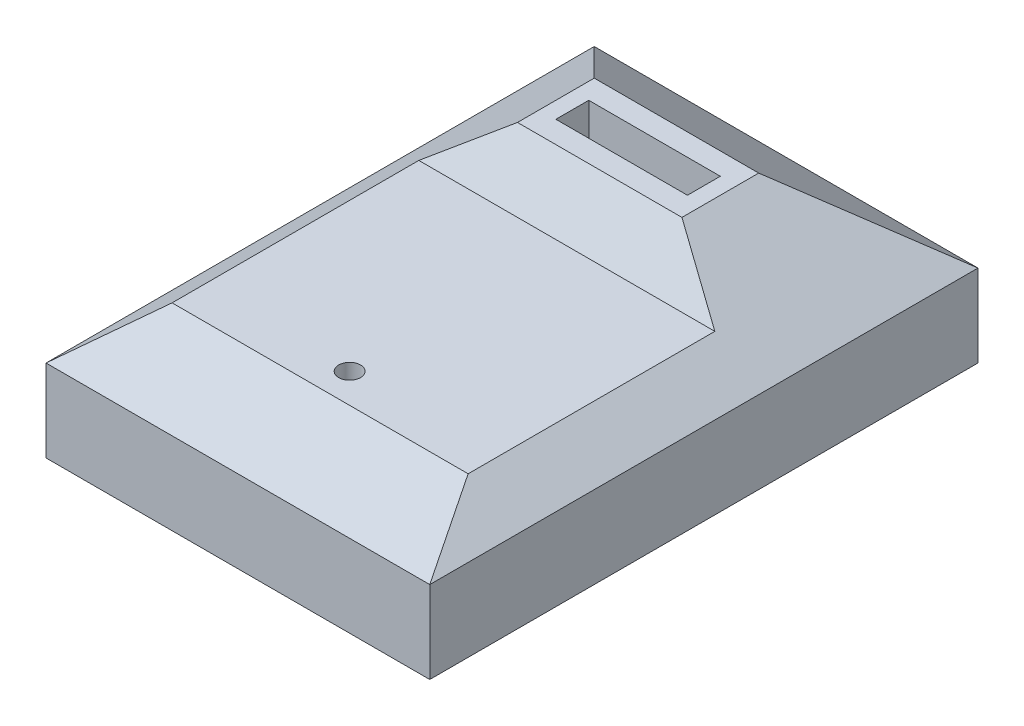
ISO-10303-21;
HEADER;
FILE_DESCRIPTION(('STEP AP214'),'2;1');
FILE_NAME('part.step','',(''),(''),'','','');
FILE_SCHEMA(('AUTOMOTIVE_DESIGN { 1 0 10303 214 1 1 1 1 }'));
ENDSEC;
DATA;
#1=APPLICATION_CONTEXT('core data for automotive mechanical design processes');
#2=APPLICATION_PROTOCOL_DEFINITION('international standard','automotive_design',2000,#1);
#3=PRODUCT_CONTEXT('',#1,'mechanical');
#4=PRODUCT('Part','Part','',(#3));
#5=PRODUCT_RELATED_PRODUCT_CATEGORY('part','',(#4));
#6=PRODUCT_DEFINITION_FORMATION('','',#4);
#7=PRODUCT_DEFINITION_CONTEXT('part definition',#1,'design');
#8=PRODUCT_DEFINITION('design','',#6,#7);
#9=PRODUCT_DEFINITION_SHAPE('','',#8);
#10=(LENGTH_UNIT() NAMED_UNIT(*) SI_UNIT(.MILLI.,.METRE.));
#11=(NAMED_UNIT(*) PLANE_ANGLE_UNIT() SI_UNIT($,.RADIAN.));
#12=(NAMED_UNIT(*) SI_UNIT($,.STERADIAN.) SOLID_ANGLE_UNIT());
#13=UNCERTAINTY_MEASURE_WITH_UNIT(LENGTH_MEASURE(1.E-05),#10,'distance_accuracy_value','');
#14=(GEOMETRIC_REPRESENTATION_CONTEXT(3) GLOBAL_UNCERTAINTY_ASSIGNED_CONTEXT((#13)) GLOBAL_UNIT_ASSIGNED_CONTEXT((#10,
#11,#12)) REPRESENTATION_CONTEXT('',''));
#15=CARTESIAN_POINT('',(0.,0.,0.));
#16=DIRECTION('',(0.,0.,1.));
#17=DIRECTION('',(1.,0.,0.));
#18=AXIS2_PLACEMENT_3D('',#15,#16,#17);
#19=CARTESIAN_POINT('',(35.,30.,79.6148351928655));
#20=DIRECTION('',(0.,-1.,0.));
#21=DIRECTION('',(0.,0.,-1.));
#22=AXIS2_PLACEMENT_3D('',#19,#20,#21);
#23=CYLINDRICAL_SURFACE('',#22,1.5);
#24=CARTESIAN_POINT('',(35.,12.,79.6148351928655));
#25=DIRECTION('',(0.,-1.,0.));
#26=DIRECTION('',(0.,0.,-1.));
#27=AXIS2_PLACEMENT_3D('',#24,#25,#26);
#28=CIRCLE('',#27,1.5);
#29=CARTESIAN_POINT('',(35.,12.,78.1148351928655));
#30=VERTEX_POINT('',#29);
#31=EDGE_CURVE('E363',#30,#30,#28,.T.);
#32=ORIENTED_EDGE('',*,*,#31,.T.);
#33=EDGE_LOOP('',(#32));
#34=FACE_BOUND('',#33,.T.);
#35=CARTESIAN_POINT('',(35.,18.,79.6148351928655));
#36=DIRECTION('',(0.,1.,0.));
#37=DIRECTION('',(0.,0.,1.));
#38=AXIS2_PLACEMENT_3D('',#35,#36,#37);
#39=CIRCLE('',#38,1.5);
#40=CARTESIAN_POINT('',(35.,18.,81.1148351928655));
#41=VERTEX_POINT('',#40);
#42=EDGE_CURVE('E359',#41,#41,#39,.F.);
#43=ORIENTED_EDGE('',*,*,#42,.F.);
#44=EDGE_LOOP('',(#43));
#45=FACE_BOUND('',#44,.T.);
#46=ADVANCED_FACE('F39',(#34,#45),#23,.F.);
#47=CARTESIAN_POINT('',(0.,0.,100.));
#48=DIRECTION('',(0.,1.,0.));
#49=DIRECTION('',(0.,0.,1.));
#50=AXIS2_PLACEMENT_3D('',#47,#48,#49);
#51=PLANE('',#50);
#52=DIRECTION('',(1.,0.,0.));
#53=VECTOR('',#52,1.);
#54=CARTESIAN_POINT('',(0.,0.,0.));
#55=LINE('',#54,#53);
#56=CARTESIAN_POINT('',(0.,0.,0.));
#57=VERTEX_POINT('',#56);
#58=CARTESIAN_POINT('',(70.,0.,0.));
#59=VERTEX_POINT('',#58);
#60=EDGE_CURVE('E560',#57,#59,#55,.T.);
#61=ORIENTED_EDGE('',*,*,#60,.T.);
#62=DIRECTION('',(0.,0.,-1.));
#63=VECTOR('',#62,1.);
#64=CARTESIAN_POINT('',(70.,0.,100.));
#65=LINE('',#64,#63);
#66=CARTESIAN_POINT('',(70.,0.,100.));
#67=VERTEX_POINT('',#66);
#68=EDGE_CURVE('E557',#67,#59,#65,.T.);
#69=ORIENTED_EDGE('',*,*,#68,.F.);
#70=DIRECTION('',(1.,0.,0.));
#71=VECTOR('',#70,1.);
#72=CARTESIAN_POINT('',(0.,0.,100.));
#73=LINE('',#72,#71);
#74=CARTESIAN_POINT('',(0.,0.,100.));
#75=VERTEX_POINT('',#74);
#76=EDGE_CURVE('E549',#75,#67,#73,.T.);
#77=ORIENTED_EDGE('',*,*,#76,.F.);
#78=DIRECTION('',(0.,0.,-1.));
#79=VECTOR('',#78,1.);
#80=CARTESIAN_POINT('',(0.,0.,100.));
#81=LINE('',#80,#79);
#82=EDGE_CURVE('E569',#75,#57,#81,.T.);
#83=ORIENTED_EDGE('',*,*,#82,.T.);
#84=EDGE_LOOP('',(#61,#69,#77,#83));
#85=FACE_BOUND('',#84,.T.);
#86=DIRECTION('',(1.,0.,0.));
#87=VECTOR('',#86,1.);
#88=CARTESIAN_POINT('',(0.,0.,2.));
#89=LINE('',#88,#87);
#90=CARTESIAN_POINT('',(2.,0.,2.));
#91=VERTEX_POINT('',#90);
#92=CARTESIAN_POINT('',(68.,0.,2.));
#93=VERTEX_POINT('',#92);
#94=EDGE_CURVE('E401',#91,#93,#89,.T.);
#95=ORIENTED_EDGE('',*,*,#94,.F.);
#96=DIRECTION('',(0.,0.,-1.));
#97=VECTOR('',#96,1.);
#98=CARTESIAN_POINT('',(2.,0.,100.));
#99=LINE('',#98,#97);
#100=CARTESIAN_POINT('',(2.,0.,98.));
#101=VERTEX_POINT('',#100);
#102=EDGE_CURVE('E434',#101,#91,#99,.T.);
#103=ORIENTED_EDGE('',*,*,#102,.F.);
#104=DIRECTION('',(1.,0.,0.));
#105=VECTOR('',#104,1.);
#106=CARTESIAN_POINT('',(0.,0.,98.));
#107=LINE('',#106,#105);
#108=CARTESIAN_POINT('',(68.,0.,98.));
#109=VERTEX_POINT('',#108);
#110=EDGE_CURVE('E390',#101,#109,#107,.T.);
#111=ORIENTED_EDGE('',*,*,#110,.T.);
#112=DIRECTION('',(0.,0.,-1.));
#113=VECTOR('',#112,1.);
#114=CARTESIAN_POINT('',(68.,0.,100.));
#115=LINE('',#114,#113);
#116=EDGE_CURVE('E407',#109,#93,#115,.T.);
#117=ORIENTED_EDGE('',*,*,#116,.T.);
#118=EDGE_LOOP('',(#95,#103,#111,#117));
#119=FACE_BOUND('',#118,.T.);
#120=ADVANCED_FACE('F632',(#85,#119),#51,.F.);
#121=CARTESIAN_POINT('',(0.,0.,100.));
#122=DIRECTION('',(1.,0.,0.));
#123=DIRECTION('',(0.,0.,-1.));
#124=AXIS2_PLACEMENT_3D('',#121,#122,#123);
#125=PLANE('',#124);
#126=DIRECTION('',(0.,-1.,0.));
#127=VECTOR('',#126,1.);
#128=CARTESIAN_POINT('',(0.,0.,100.));
#129=LINE('',#128,#127);
#130=CARTESIAN_POINT('',(0.,15.,100.));
#131=VERTEX_POINT('',#130);
#132=EDGE_CURVE('E546',#131,#75,#129,.T.);
#133=ORIENTED_EDGE('',*,*,#132,.F.);
#134=DIRECTION('',(0.,0.,1.));
#135=VECTOR('',#134,1.);
#136=CARTESIAN_POINT('',(0.,15.,0.));
#137=LINE('',#136,#135);
#138=CARTESIAN_POINT('',(0.,15.,0.));
#139=VERTEX_POINT('',#138);
#140=EDGE_CURVE('E527',#139,#131,#137,.T.);
#141=ORIENTED_EDGE('',*,*,#140,.F.);
#142=DIRECTION('',(0.,-1.,0.));
#143=VECTOR('',#142,1.);
#144=CARTESIAN_POINT('',(0.,0.,0.));
#145=LINE('',#144,#143);
#146=EDGE_CURVE('E542',#139,#57,#145,.T.);
#147=ORIENTED_EDGE('',*,*,#146,.T.);
#148=ORIENTED_EDGE('',*,*,#82,.F.);
#149=EDGE_LOOP('',(#133,#141,#147,#148));
#150=FACE_BOUND('',#149,.T.);
#151=ADVANCED_FACE('F41',(#150),#125,.F.);
#152=CARTESIAN_POINT('',(70.,0.,100.));
#153=DIRECTION('',(-1.,0.,0.));
#154=DIRECTION('',(0.,0.,1.));
#155=AXIS2_PLACEMENT_3D('',#152,#153,#154);
#156=PLANE('',#155);
#157=DIRECTION('',(0.,1.,0.));
#158=VECTOR('',#157,1.);
#159=CARTESIAN_POINT('',(70.,0.,0.));
#160=LINE('',#159,#158);
#161=CARTESIAN_POINT('',(70.,15.,0.));
#162=VERTEX_POINT('',#161);
#163=EDGE_CURVE('E550',#59,#162,#160,.T.);
#164=ORIENTED_EDGE('',*,*,#163,.T.);
#165=DIRECTION('',(0.,0.,1.));
#166=VECTOR('',#165,1.);
#167=CARTESIAN_POINT('',(70.,15.,0.));
#168=LINE('',#167,#166);
#169=CARTESIAN_POINT('',(70.,15.,100.));
#170=VERTEX_POINT('',#169);
#171=EDGE_CURVE('E531',#162,#170,#168,.T.);
#172=ORIENTED_EDGE('',*,*,#171,.T.);
#173=DIRECTION('',(0.,1.,0.));
#174=VECTOR('',#173,1.);
#175=CARTESIAN_POINT('',(70.,0.,100.));
#176=LINE('',#175,#174);
#177=EDGE_CURVE('E553',#67,#170,#176,.T.);
#178=ORIENTED_EDGE('',*,*,#177,.F.);
#179=ORIENTED_EDGE('',*,*,#68,.T.);
#180=EDGE_LOOP('',(#164,#172,#178,#179));
#181=FACE_BOUND('',#180,.T.);
#182=ADVANCED_FACE('F738',(#181),#156,.F.);
#183=CARTESIAN_POINT('',(0.,30.,100.));
#184=DIRECTION('',(0.,-1.,0.));
#185=DIRECTION('',(0.,0.,-1.));
#186=AXIS2_PLACEMENT_3D('',#183,#184,#185);
#187=PLANE('',#186);
#188=DIRECTION('',(-1.,0.,0.));
#189=VECTOR('',#188,1.);
#190=CARTESIAN_POINT('',(23.,30.,24.));
#191=LINE('',#190,#189);
#192=CARTESIAN_POINT('',(47.,30.,24.));
#193=VERTEX_POINT('',#192);
#194=CARTESIAN_POINT('',(23.,30.,24.));
#195=VERTEX_POINT('',#194);
#196=EDGE_CURVE('E299',#193,#195,#191,.T.);
#197=ORIENTED_EDGE('',*,*,#196,.F.);
#198=DIRECTION('',(0.,0.,-1.));
#199=VECTOR('',#198,1.);
#200=CARTESIAN_POINT('',(47.,30.,30.));
#201=LINE('',#200,#199);
#202=CARTESIAN_POINT('',(47.,30.,30.));
#203=VERTEX_POINT('',#202);
#204=EDGE_CURVE('E247',#203,#193,#201,.T.);
#205=ORIENTED_EDGE('',*,*,#204,.F.);
#206=DIRECTION('',(1.,0.,0.));
#207=VECTOR('',#206,1.);
#208=CARTESIAN_POINT('',(23.,30.,30.));
#209=LINE('',#208,#207);
#210=CARTESIAN_POINT('',(23.,30.,30.));
#211=VERTEX_POINT('',#210);
#212=EDGE_CURVE('E284',#211,#203,#209,.T.);
#213=ORIENTED_EDGE('',*,*,#212,.F.);
#214=DIRECTION('',(0.,0.,1.));
#215=VECTOR('',#214,1.);
#216=CARTESIAN_POINT('',(23.,30.,30.));
#217=LINE('',#216,#215);
#218=EDGE_CURVE('E303',#195,#211,#217,.T.);
#219=ORIENTED_EDGE('',*,*,#218,.F.);
#220=EDGE_LOOP('',(#197,#205,#213,#219));
#221=FACE_BOUND('',#220,.T.);
#222=DIRECTION('',(0.,0.,1.));
#223=VECTOR('',#222,1.);
#224=CARTESIAN_POINT('',(20.,30.,0.));
#225=LINE('',#224,#223);
#226=CARTESIAN_POINT('',(20.,30.,20.));
#227=VERTEX_POINT('',#226);
#228=CARTESIAN_POINT('',(20.,30.,34.));
#229=VERTEX_POINT('',#228);
#230=EDGE_CURVE('E522',#227,#229,#225,.T.);
#231=ORIENTED_EDGE('',*,*,#230,.T.);
#232=DIRECTION('',(1.,0.,0.));
#233=VECTOR('',#232,1.);
#234=CARTESIAN_POINT('',(0.,30.,34.));
#235=LINE('',#234,#233);
#236=CARTESIAN_POINT('',(50.,30.,34.));
#237=VERTEX_POINT('',#236);
#238=EDGE_CURVE('E495',#229,#237,#235,.T.);
#239=ORIENTED_EDGE('',*,*,#238,.T.);
#240=DIRECTION('',(0.,0.,1.));
#241=VECTOR('',#240,1.);
#242=CARTESIAN_POINT('',(50.,30.,0.));
#243=LINE('',#242,#241);
#244=CARTESIAN_POINT('',(50.,30.,20.));
#245=VERTEX_POINT('',#244);
#246=EDGE_CURVE('E521',#245,#237,#243,.T.);
#247=ORIENTED_EDGE('',*,*,#246,.F.);
#248=DIRECTION('',(1.,0.,0.));
#249=VECTOR('',#248,1.);
#250=CARTESIAN_POINT('',(0.,30.,20.));
#251=LINE('',#250,#249);
#252=EDGE_CURVE('E526',#227,#245,#251,.T.);
#253=ORIENTED_EDGE('',*,*,#252,.F.);
#254=EDGE_LOOP('',(#231,#239,#247,#253));
#255=FACE_BOUND('',#254,.T.);
#256=ADVANCED_FACE('F731',(#221,#255),#187,.F.);
#257=CARTESIAN_POINT('',(0.,0.,100.));
#258=DIRECTION('',(0.,0.,-1.));
#259=DIRECTION('',(-1.,0.,0.));
#260=AXIS2_PLACEMENT_3D('',#257,#258,#259);
#261=PLANE('',#260);
#262=ORIENTED_EDGE('',*,*,#177,.T.);
#263=DIRECTION('',(1.,0.,0.));
#264=VECTOR('',#263,1.);
#265=CARTESIAN_POINT('',(0.,15.,100.));
#266=LINE('',#265,#264);
#267=EDGE_CURVE('E483',#131,#170,#266,.T.);
#268=ORIENTED_EDGE('',*,*,#267,.F.);
#269=ORIENTED_EDGE('',*,*,#132,.T.);
#270=ORIENTED_EDGE('',*,*,#76,.T.);
#271=EDGE_LOOP('',(#262,#268,#269,#270));
#272=FACE_BOUND('',#271,.T.);
#273=ADVANCED_FACE('F728',(#272),#261,.F.);
#274=CARTESIAN_POINT('',(0.,0.,0.));
#275=DIRECTION('',(0.,0.,-1.));
#276=DIRECTION('',(-1.,0.,0.));
#277=AXIS2_PLACEMENT_3D('',#274,#275,#276);
#278=PLANE('',#277);
#279=DIRECTION('',(1.,0.,0.));
#280=VECTOR('',#279,1.);
#281=CARTESIAN_POINT('',(0.,15.,0.));
#282=LINE('',#281,#280);
#283=EDGE_CURVE('E538',#139,#162,#282,.T.);
#284=ORIENTED_EDGE('',*,*,#283,.T.);
#285=ORIENTED_EDGE('',*,*,#163,.F.);
#286=ORIENTED_EDGE('',*,*,#60,.F.);
#287=ORIENTED_EDGE('',*,*,#146,.F.);
#288=EDGE_LOOP('',(#284,#285,#286,#287));
#289=FACE_BOUND('',#288,.T.);
#290=ADVANCED_FACE('F726',(#289),#278,.T.);
#291=CARTESIAN_POINT('',(0.,15.,0.));
#292=DIRECTION('',(0.,-0.8,0.6));
#293=DIRECTION('',(0.,-0.6,-0.8));
#294=AXIS2_PLACEMENT_3D('',#291,#292,#293);
#295=PLANE('',#294);
#296=ORIENTED_EDGE('',*,*,#283,.F.);
#297=DIRECTION('',(0.624695047554424,0.468521285665818,0.624695047554424));
#298=VECTOR('',#297,1.);
#299=CARTESIAN_POINT('',(0.,15.,0.));
#300=LINE('',#299,#298);
#301=EDGE_CURVE('E577',#139,#227,#300,.T.);
#302=ORIENTED_EDGE('',*,*,#301,.T.);
#303=ORIENTED_EDGE('',*,*,#252,.T.);
#304=DIRECTION('',(0.624695047554424,-0.468521285665818,-0.624695047554424));
#305=VECTOR('',#304,1.);
#306=CARTESIAN_POINT('',(42.6829268292683,35.4878048780488,27.3170731707317));
#307=LINE('',#306,#305);
#308=EDGE_CURVE('E573',#245,#162,#307,.T.);
#309=ORIENTED_EDGE('',*,*,#308,.T.);
#310=EDGE_LOOP('',(#296,#302,#303,#309));
#311=FACE_BOUND('',#310,.T.);
#312=ADVANCED_FACE('F722',(#311),#295,.F.);
#313=CARTESIAN_POINT('',(50.,30.,0.));
#314=DIRECTION('',(-0.6,-0.8,0.));
#315=DIRECTION('',(0.8,-0.6,0.));
#316=AXIS2_PLACEMENT_3D('',#313,#314,#315);
#317=PLANE('',#316);
#318=ORIENTED_EDGE('',*,*,#246,.T.);
#319=DIRECTION('',(0.742781352708208,-0.557086014531156,0.371390676354103));
#320=VECTOR('',#319,1.);
#321=CARTESIAN_POINT('',(40.6206896551724,37.0344827586207,29.3103448275862));
#322=LINE('',#321,#320);
#323=CARTESIAN_POINT('',(62.,21.,40.));
#324=VERTEX_POINT('',#323);
#325=EDGE_CURVE('E517',#237,#324,#322,.T.);
#326=ORIENTED_EDGE('',*,*,#325,.T.);
#327=DIRECTION('',(0.,0.,1.));
#328=VECTOR('',#327,1.);
#329=CARTESIAN_POINT('',(62.,21.,0.));
#330=LINE('',#329,#328);
#331=CARTESIAN_POINT('',(62.,21.,85.));
#332=VERTEX_POINT('',#331);
#333=EDGE_CURVE('E513',#324,#332,#330,.T.);
#334=ORIENTED_EDGE('',*,*,#333,.T.);
#335=DIRECTION('',(0.443760156980183,-0.332820117735137,0.832050294337844));
#336=VECTOR('',#335,1.);
#337=CARTESIAN_POINT('',(26.923076923077,47.3076923076923,19.2307692307692));
#338=LINE('',#337,#336);
#339=EDGE_CURVE('E499',#332,#170,#338,.T.);
#340=ORIENTED_EDGE('',*,*,#339,.T.);
#341=ORIENTED_EDGE('',*,*,#171,.F.);
#342=ORIENTED_EDGE('',*,*,#308,.F.);
#343=EDGE_LOOP('',(#318,#326,#334,#340,#341,#342));
#344=FACE_BOUND('',#343,.T.);
#345=ADVANCED_FACE('F718',(#344),#317,.F.);
#346=CARTESIAN_POINT('',(20.,30.,0.));
#347=DIRECTION('',(0.6,-0.8,0.));
#348=DIRECTION('',(0.8,0.6,0.));
#349=AXIS2_PLACEMENT_3D('',#346,#347,#348);
#350=PLANE('',#349);
#351=DIRECTION('',(0.,0.,-1.));
#352=VECTOR('',#351,1.);
#353=CARTESIAN_POINT('',(7.99999999999998,21.,0.));
#354=LINE('',#353,#352);
#355=CARTESIAN_POINT('',(7.99999999999998,21.,85.));
#356=VERTEX_POINT('',#355);
#357=CARTESIAN_POINT('',(7.99999999999998,21.,40.));
#358=VERTEX_POINT('',#357);
#359=EDGE_CURVE('E585',#356,#358,#354,.T.);
#360=ORIENTED_EDGE('',*,*,#359,.T.);
#361=DIRECTION('',(0.742781352708208,0.557086014531156,-0.371390676354103));
#362=VECTOR('',#361,1.);
#363=CARTESIAN_POINT('',(29.3793103448276,37.0344827586207,29.3103448275862));
#364=LINE('',#363,#362);
#365=EDGE_CURVE('E377',#358,#229,#364,.T.);
#366=ORIENTED_EDGE('',*,*,#365,.T.);
#367=ORIENTED_EDGE('',*,*,#230,.F.);
#368=ORIENTED_EDGE('',*,*,#301,.F.);
#369=ORIENTED_EDGE('',*,*,#140,.T.);
#370=DIRECTION('',(0.443760156980183,0.332820117735137,-0.832050294337844));
#371=VECTOR('',#370,1.);
#372=CARTESIAN_POINT('',(43.076923076923,47.3076923076923,19.2307692307692));
#373=LINE('',#372,#371);
#374=EDGE_CURVE('E581',#131,#356,#373,.T.);
#375=ORIENTED_EDGE('',*,*,#374,.T.);
#376=EDGE_LOOP('',(#360,#366,#367,#368,#369,#375));
#377=FACE_BOUND('',#376,.T.);
#378=ADVANCED_FACE('F708',(#377),#350,.F.);
#379=CARTESIAN_POINT('',(0.,21.,40.));
#380=DIRECTION('',(0.,-0.554700196225229,-0.832050294337844));
#381=DIRECTION('',(0.,0.832050294337844,-0.554700196225229));
#382=AXIS2_PLACEMENT_3D('',#379,#380,#381);
#383=PLANE('',#382);
#384=ORIENTED_EDGE('',*,*,#238,.F.);
#385=ORIENTED_EDGE('',*,*,#365,.F.);
#386=DIRECTION('',(1.,0.,0.));
#387=VECTOR('',#386,1.);
#388=CARTESIAN_POINT('',(0.,21.,40.));
#389=LINE('',#388,#387);
#390=EDGE_CURVE('E500',#358,#324,#389,.T.);
#391=ORIENTED_EDGE('',*,*,#390,.T.);
#392=ORIENTED_EDGE('',*,*,#325,.F.);
#393=EDGE_LOOP('',(#384,#385,#391,#392));
#394=FACE_BOUND('',#393,.T.);
#395=ADVANCED_FACE('F704',(#394),#383,.F.);
#396=CARTESIAN_POINT('',(0.,21.,85.));
#397=DIRECTION('',(0.,-1.,0.));
#398=DIRECTION('',(0.,0.,-1.));
#399=AXIS2_PLACEMENT_3D('',#396,#397,#398);
#400=PLANE('',#399);
#401=CARTESIAN_POINT('',(35.,21.,79.6148351928655));
#402=DIRECTION('',(0.,1.,0.));
#403=DIRECTION('',(0.,0.,1.));
#404=AXIS2_PLACEMENT_3D('',#401,#402,#403);
#405=CIRCLE('',#404,2.);
#406=CARTESIAN_POINT('',(35.,21.,81.6148351928655));
#407=VERTEX_POINT('',#406);
#408=EDGE_CURVE('E343',#407,#407,#405,.T.);
#409=ORIENTED_EDGE('',*,*,#408,.F.);
#410=EDGE_LOOP('',(#409));
#411=FACE_BOUND('',#410,.T.);
#412=ORIENTED_EDGE('',*,*,#390,.F.);
#413=ORIENTED_EDGE('',*,*,#359,.F.);
#414=DIRECTION('',(1.,0.,0.));
#415=VECTOR('',#414,1.);
#416=CARTESIAN_POINT('',(0.,21.,85.));
#417=LINE('',#416,#415);
#418=EDGE_CURVE('E504',#356,#332,#417,.T.);
#419=ORIENTED_EDGE('',*,*,#418,.T.);
#420=ORIENTED_EDGE('',*,*,#333,.F.);
#421=EDGE_LOOP('',(#412,#413,#419,#420));
#422=FACE_BOUND('',#421,.T.);
#423=ADVANCED_FACE('F707',(#411,#422),#400,.F.);
#424=CARTESIAN_POINT('',(0.,15.,100.));
#425=DIRECTION('',(0.,-0.92847669088526,-0.371390676354103));
#426=DIRECTION('',(0.,0.371390676354103,-0.92847669088526));
#427=AXIS2_PLACEMENT_3D('',#424,#425,#426);
#428=PLANE('',#427);
#429=ORIENTED_EDGE('',*,*,#418,.F.);
#430=ORIENTED_EDGE('',*,*,#374,.F.);
#431=ORIENTED_EDGE('',*,*,#267,.T.);
#432=ORIENTED_EDGE('',*,*,#339,.F.);
#433=EDGE_LOOP('',(#429,#430,#431,#432));
#434=FACE_BOUND('',#433,.T.);
#435=ADVANCED_FACE('F666',(#434),#428,.F.);
#436=CARTESIAN_POINT('',(2.,0.,100.));
#437=DIRECTION('',(1.,0.,0.));
#438=DIRECTION('',(0.,0.,-1.));
#439=AXIS2_PLACEMENT_3D('',#436,#437,#438);
#440=PLANE('',#439);
#441=DIRECTION('',(0.,-1.,0.));
#442=VECTOR('',#441,1.);
#443=CARTESIAN_POINT('',(2.,0.,98.));
#444=LINE('',#443,#442);
#445=CARTESIAN_POINT('',(2.,13.6459340771462,98.));
#446=VERTEX_POINT('',#445);
#447=EDGE_CURVE('E386',#446,#101,#444,.T.);
#448=ORIENTED_EDGE('',*,*,#447,.T.);
#449=ORIENTED_EDGE('',*,*,#102,.T.);
#450=DIRECTION('',(0.,-1.,0.));
#451=VECTOR('',#450,1.);
#452=CARTESIAN_POINT('',(2.,0.,2.));
#453=LINE('',#452,#451);
#454=CARTESIAN_POINT('',(2.,14.,2.));
#455=VERTEX_POINT('',#454);
#456=EDGE_CURVE('E398',#455,#91,#453,.T.);
#457=ORIENTED_EDGE('',*,*,#456,.F.);
#458=DIRECTION('',(0.,0.,1.));
#459=VECTOR('',#458,1.);
#460=CARTESIAN_POINT('',(2.,14.,0.));
#461=LINE('',#460,#459);
#462=CARTESIAN_POINT('',(2.,14.,97.1148351928655));
#463=VERTEX_POINT('',#462);
#464=EDGE_CURVE('E392',#455,#463,#461,.T.);
#465=ORIENTED_EDGE('',*,*,#464,.T.);
#466=DIRECTION('',(0.,0.371390676354103,-0.92847669088526));
#467=VECTOR('',#466,1.);
#468=CARTESIAN_POINT('',(2.,11.0740811009881,104.429632440395));
#469=LINE('',#468,#467);
#470=EDGE_CURVE('E479',#446,#463,#469,.T.);
#471=ORIENTED_EDGE('',*,*,#470,.F.);
#472=EDGE_LOOP('',(#448,#449,#457,#465,#471));
#473=FACE_BOUND('',#472,.T.);
#474=ADVANCED_FACE('F662',(#473),#440,.T.);
#475=CARTESIAN_POINT('',(68.,0.,100.));
#476=DIRECTION('',(-1.,0.,0.));
#477=DIRECTION('',(0.,0.,1.));
#478=AXIS2_PLACEMENT_3D('',#475,#476,#477);
#479=PLANE('',#478);
#480=DIRECTION('',(0.,1.,0.));
#481=VECTOR('',#480,1.);
#482=CARTESIAN_POINT('',(68.,0.,2.));
#483=LINE('',#482,#481);
#484=CARTESIAN_POINT('',(68.,14.,2.));
#485=VERTEX_POINT('',#484);
#486=EDGE_CURVE('E391',#93,#485,#483,.T.);
#487=ORIENTED_EDGE('',*,*,#486,.F.);
#488=ORIENTED_EDGE('',*,*,#116,.F.);
#489=DIRECTION('',(0.,1.,0.));
#490=VECTOR('',#489,1.);
#491=CARTESIAN_POINT('',(68.,0.,98.));
#492=LINE('',#491,#490);
#493=CARTESIAN_POINT('',(68.,13.6459340771462,98.));
#494=VERTEX_POINT('',#493);
#495=EDGE_CURVE('E403',#109,#494,#492,.T.);
#496=ORIENTED_EDGE('',*,*,#495,.T.);
#497=DIRECTION('',(0.,0.371390676354103,-0.92847669088526));
#498=VECTOR('',#497,1.);
#499=CARTESIAN_POINT('',(68.,13.1430466182295,99.2572186472918));
#500=LINE('',#499,#498);
#501=CARTESIAN_POINT('',(68.,14.,97.1148351928655));
#502=VERTEX_POINT('',#501);
#503=EDGE_CURVE('E462',#494,#502,#500,.T.);
#504=ORIENTED_EDGE('',*,*,#503,.T.);
#505=DIRECTION('',(0.,0.,1.));
#506=VECTOR('',#505,1.);
#507=CARTESIAN_POINT('',(68.,14.,100.));
#508=LINE('',#507,#506);
#509=EDGE_CURVE('E397',#485,#502,#508,.T.);
#510=ORIENTED_EDGE('',*,*,#509,.F.);
#511=EDGE_LOOP('',(#487,#488,#496,#504,#510));
#512=FACE_BOUND('',#511,.T.);
#513=ADVANCED_FACE('F665',(#512),#479,.T.);
#514=CARTESIAN_POINT('',(0.,28.,100.));
#515=DIRECTION('',(0.,-1.,0.));
#516=DIRECTION('',(0.,0.,-1.));
#517=AXIS2_PLACEMENT_3D('',#514,#515,#516);
#518=PLANE('',#517);
#519=DIRECTION('',(0.,0.,1.));
#520=VECTOR('',#519,1.);
#521=CARTESIAN_POINT('',(48.,28.,100.));
#522=LINE('',#521,#520);
#523=CARTESIAN_POINT('',(48.,28.,23.));
#524=VERTEX_POINT('',#523);
#525=CARTESIAN_POINT('',(48.,28.,31.));
#526=VERTEX_POINT('',#525);
#527=EDGE_CURVE('E11',#524,#526,#522,.T.);
#528=ORIENTED_EDGE('',*,*,#527,.F.);
#529=DIRECTION('',(1.,0.,0.));
#530=VECTOR('',#529,1.);
#531=CARTESIAN_POINT('',(0.,28.,23.));
#532=LINE('',#531,#530);
#533=CARTESIAN_POINT('',(22.,28.,23.));
#534=VERTEX_POINT('',#533);
#535=EDGE_CURVE('E376',#534,#524,#532,.T.);
#536=ORIENTED_EDGE('',*,*,#535,.F.);
#537=DIRECTION('',(0.,0.,-1.));
#538=VECTOR('',#537,1.);
#539=CARTESIAN_POINT('',(22.,28.,100.));
#540=LINE('',#539,#538);
#541=CARTESIAN_POINT('',(22.,28.,31.));
#542=VERTEX_POINT('',#541);
#543=EDGE_CURVE('E598',#542,#534,#540,.T.);
#544=ORIENTED_EDGE('',*,*,#543,.F.);
#545=DIRECTION('',(-1.,0.,0.));
#546=VECTOR('',#545,1.);
#547=CARTESIAN_POINT('',(0.,28.,31.));
#548=LINE('',#547,#546);
#549=EDGE_CURVE('E48',#526,#542,#548,.T.);
#550=ORIENTED_EDGE('',*,*,#549,.F.);
#551=EDGE_LOOP('',(#528,#536,#544,#550));
#552=FACE_BOUND('',#551,.T.);
#553=DIRECTION('',(0.,0.,1.));
#554=VECTOR('',#553,1.);
#555=CARTESIAN_POINT('',(20.6666666666667,28.,100.));
#556=LINE('',#555,#554);
#557=CARTESIAN_POINT('',(20.6666666666667,28.,20.6666666666667));
#558=VERTEX_POINT('',#557);
#559=CARTESIAN_POINT('',(20.6666666666667,28.,32.929632483024));
#560=VERTEX_POINT('',#559);
#561=EDGE_CURVE('E396',#558,#560,#556,.T.);
#562=ORIENTED_EDGE('',*,*,#561,.F.);
#563=DIRECTION('',(1.,0.,0.));
#564=VECTOR('',#563,1.);
#565=CARTESIAN_POINT('',(0.,28.,20.6666666666667));
#566=LINE('',#565,#564);
#567=CARTESIAN_POINT('',(49.3333333333333,28.,20.6666666666667));
#568=VERTEX_POINT('',#567);
#569=EDGE_CURVE('E421',#558,#568,#566,.T.);
#570=ORIENTED_EDGE('',*,*,#569,.T.);
#571=DIRECTION('',(0.,0.,1.));
#572=VECTOR('',#571,1.);
#573=CARTESIAN_POINT('',(49.3333333333333,28.,0.));
#574=LINE('',#573,#572);
#575=CARTESIAN_POINT('',(49.3333333333333,28.,32.929632483024));
#576=VERTEX_POINT('',#575);
#577=EDGE_CURVE('E417',#568,#576,#574,.T.);
#578=ORIENTED_EDGE('',*,*,#577,.T.);
#579=DIRECTION('',(1.,0.,0.));
#580=VECTOR('',#579,1.);
#581=CARTESIAN_POINT('',(0.,28.,32.929632483024));
#582=LINE('',#581,#580);
#583=EDGE_CURVE('E438',#560,#576,#582,.T.);
#584=ORIENTED_EDGE('',*,*,#583,.F.);
#585=EDGE_LOOP('',(#562,#570,#578,#584));
#586=FACE_BOUND('',#585,.T.);
#587=ADVANCED_FACE('F616',(#552,#586),#518,.T.);
#588=CARTESIAN_POINT('',(0.,0.,98.));
#589=DIRECTION('',(0.,0.,-1.));
#590=DIRECTION('',(-1.,0.,0.));
#591=AXIS2_PLACEMENT_3D('',#588,#589,#590);
#592=PLANE('',#591);
#593=ORIENTED_EDGE('',*,*,#495,.F.);
#594=ORIENTED_EDGE('',*,*,#110,.F.);
#595=ORIENTED_EDGE('',*,*,#447,.F.);
#596=DIRECTION('',(1.,0.,0.));
#597=VECTOR('',#596,1.);
#598=CARTESIAN_POINT('',(0.,13.6459340771462,98.));
#599=LINE('',#598,#597);
#600=EDGE_CURVE('E382',#446,#494,#599,.T.);
#601=ORIENTED_EDGE('',*,*,#600,.T.);
#602=EDGE_LOOP('',(#593,#594,#595,#601));
#603=FACE_BOUND('',#602,.T.);
#604=ADVANCED_FACE('F673',(#603),#592,.T.);
#605=CARTESIAN_POINT('',(0.,0.,2.));
#606=DIRECTION('',(0.,0.,-1.));
#607=DIRECTION('',(-1.,0.,0.));
#608=AXIS2_PLACEMENT_3D('',#605,#606,#607);
#609=PLANE('',#608);
#610=DIRECTION('',(1.,0.,0.));
#611=VECTOR('',#610,1.);
#612=CARTESIAN_POINT('',(0.,14.,2.));
#613=LINE('',#612,#611);
#614=EDGE_CURVE('E402',#455,#485,#613,.T.);
#615=ORIENTED_EDGE('',*,*,#614,.F.);
#616=ORIENTED_EDGE('',*,*,#456,.T.);
#617=ORIENTED_EDGE('',*,*,#94,.T.);
#618=ORIENTED_EDGE('',*,*,#486,.T.);
#619=EDGE_LOOP('',(#615,#616,#617,#618));
#620=FACE_BOUND('',#619,.T.);
#621=ADVANCED_FACE('F676',(#620),#609,.F.);
#622=CARTESIAN_POINT('',(0.,13.4,1.2));
#623=DIRECTION('',(0.,-0.8,0.6));
#624=DIRECTION('',(0.,-0.6,-0.8));
#625=AXIS2_PLACEMENT_3D('',#622,#623,#624);
#626=PLANE('',#625);
#627=ORIENTED_EDGE('',*,*,#614,.T.);
#628=DIRECTION('',(0.624695047554424,-0.468521285665818,-0.624695047554424));
#629=VECTOR('',#628,1.);
#630=CARTESIAN_POINT('',(41.9512195121951,33.5365853658537,28.0487804878049));
#631=LINE('',#630,#629);
#632=EDGE_CURVE('E427',#568,#485,#631,.T.);
#633=ORIENTED_EDGE('',*,*,#632,.F.);
#634=ORIENTED_EDGE('',*,*,#569,.F.);
#635=DIRECTION('',(0.624695047554424,0.468521285665818,0.624695047554424));
#636=VECTOR('',#635,1.);
#637=CARTESIAN_POINT('',(0.731707317073167,13.0487804878049,0.731707317073173));
#638=LINE('',#637,#636);
#639=EDGE_CURVE('E422',#455,#558,#638,.T.);
#640=ORIENTED_EDGE('',*,*,#639,.F.);
#641=EDGE_LOOP('',(#627,#633,#634,#640));
#642=FACE_BOUND('',#641,.T.);
#643=ADVANCED_FACE('F680',(#642),#626,.T.);
#644=CARTESIAN_POINT('',(48.8,28.4,0.));
#645=DIRECTION('',(-0.6,-0.8,0.));
#646=DIRECTION('',(0.8,-0.6,0.));
#647=AXIS2_PLACEMENT_3D('',#644,#645,#646);
#648=PLANE('',#647);
#649=ORIENTED_EDGE('',*,*,#577,.F.);
#650=ORIENTED_EDGE('',*,*,#632,.T.);
#651=ORIENTED_EDGE('',*,*,#509,.T.);
#652=DIRECTION('',(0.443760156980183,-0.332820117735137,0.832050294337844));
#653=VECTOR('',#652,1.);
#654=CARTESIAN_POINT('',(26.2345223903266,45.324108207255,18.8045646747278));
#655=LINE('',#654,#653);
#656=CARTESIAN_POINT('',(61.3333333333333,19.,84.6148351928655));
#657=VERTEX_POINT('',#656);
#658=EDGE_CURVE('E442',#657,#502,#655,.T.);
#659=ORIENTED_EDGE('',*,*,#658,.F.);
#660=DIRECTION('',(0.,0.,1.));
#661=VECTOR('',#660,1.);
#662=CARTESIAN_POINT('',(61.3333333333334,19.,0.));
#663=LINE('',#662,#661);
#664=CARTESIAN_POINT('',(61.3333333333334,19.,38.929632483024));
#665=VERTEX_POINT('',#664);
#666=EDGE_CURVE('E451',#665,#657,#663,.T.);
#667=ORIENTED_EDGE('',*,*,#666,.F.);
#668=DIRECTION('',(0.742781352708208,-0.557086014531156,0.371390676354103));
#669=VECTOR('',#668,1.);
#670=CARTESIAN_POINT('',(39.7895266713497,35.1578549964877,28.1577291520322));
#671=LINE('',#670,#669);
#672=EDGE_CURVE('E447',#576,#665,#671,.T.);
#673=ORIENTED_EDGE('',*,*,#672,.F.);
#674=EDGE_LOOP('',(#649,#650,#651,#659,#667,#673));
#675=FACE_BOUND('',#674,.T.);
#676=ADVANCED_FACE('F684',(#675),#648,.T.);
#677=CARTESIAN_POINT('',(21.2,28.4,0.));
#678=DIRECTION('',(0.6,-0.8,0.));
#679=DIRECTION('',(0.8,0.6,0.));
#680=AXIS2_PLACEMENT_3D('',#677,#678,#679);
#681=PLANE('',#680);
#682=DIRECTION('',(0.,0.,-1.));
#683=VECTOR('',#682,1.);
#684=CARTESIAN_POINT('',(8.66666666666664,19.,0.));
#685=LINE('',#684,#683);
#686=CARTESIAN_POINT('',(8.66666666666665,19.,84.6148351928655));
#687=VERTEX_POINT('',#686);
#688=CARTESIAN_POINT('',(8.66666666666664,19.,38.929632483024));
#689=VERTEX_POINT('',#688);
#690=EDGE_CURVE('E463',#687,#689,#685,.T.);
#691=ORIENTED_EDGE('',*,*,#690,.F.);
#692=DIRECTION('',(0.443760156980183,0.332820117735137,-0.832050294337844));
#693=VECTOR('',#692,1.);
#694=CARTESIAN_POINT('',(43.7654776096734,45.324108207255,18.8045646747278));
#695=LINE('',#694,#693);
#696=EDGE_CURVE('E426',#463,#687,#695,.T.);
#697=ORIENTED_EDGE('',*,*,#696,.F.);
#698=ORIENTED_EDGE('',*,*,#464,.F.);
#699=ORIENTED_EDGE('',*,*,#639,.T.);
#700=ORIENTED_EDGE('',*,*,#561,.T.);
#701=DIRECTION('',(0.742781352708208,0.557086014531156,-0.371390676354103));
#702=VECTOR('',#701,1.);
#703=CARTESIAN_POINT('',(30.2104733286503,35.1578549964877,28.1577291520322));
#704=LINE('',#703,#702);
#705=EDGE_CURVE('E458',#689,#560,#704,.T.);
#706=ORIENTED_EDGE('',*,*,#705,.F.);
#707=EDGE_LOOP('',(#691,#697,#698,#699,#700,#706));
#708=FACE_BOUND('',#707,.T.);
#709=ADVANCED_FACE('F688',(#708),#681,.T.);
#710=CARTESIAN_POINT('',(0.,19.8905996075495,38.3358994113243));
#711=DIRECTION('',(0.,-0.554700196225229,-0.832050294337844));
#712=DIRECTION('',(0.,0.832050294337844,-0.554700196225229));
#713=AXIS2_PLACEMENT_3D('',#710,#711,#712);
#714=PLANE('',#713);
#715=ORIENTED_EDGE('',*,*,#583,.T.);
#716=ORIENTED_EDGE('',*,*,#672,.T.);
#717=DIRECTION('',(1.,0.,0.));
#718=VECTOR('',#717,1.);
#719=CARTESIAN_POINT('',(0.,19.,38.929632483024));
#720=LINE('',#719,#718);
#721=EDGE_CURVE('E443',#689,#665,#720,.T.);
#722=ORIENTED_EDGE('',*,*,#721,.F.);
#723=ORIENTED_EDGE('',*,*,#705,.T.);
#724=EDGE_LOOP('',(#715,#716,#722,#723));
#725=FACE_BOUND('',#724,.T.);
#726=ADVANCED_FACE('F692',(#725),#714,.T.);
#727=CARTESIAN_POINT('',(0.,19.,85.));
#728=DIRECTION('',(0.,-1.,0.));
#729=DIRECTION('',(0.,0.,-1.));
#730=AXIS2_PLACEMENT_3D('',#727,#728,#729);
#731=PLANE('',#730);
#732=CARTESIAN_POINT('',(35.,19.,79.6148351928655));
#733=DIRECTION('',(0.,-1.,0.));
#734=DIRECTION('',(0.,0.,-1.));
#735=AXIS2_PLACEMENT_3D('',#732,#733,#734);
#736=CIRCLE('',#735,3.);
#737=CARTESIAN_POINT('',(35.,19.,76.6148351928655));
#738=VERTEX_POINT('',#737);
#739=EDGE_CURVE('E371',#738,#738,#736,.T.);
#740=ORIENTED_EDGE('',*,*,#739,.F.);
#741=EDGE_LOOP('',(#740));
#742=FACE_BOUND('',#741,.T.);
#743=ORIENTED_EDGE('',*,*,#721,.T.);
#744=ORIENTED_EDGE('',*,*,#666,.T.);
#745=DIRECTION('',(1.,0.,0.));
#746=VECTOR('',#745,1.);
#747=CARTESIAN_POINT('',(0.,19.,84.6148351928655));
#748=LINE('',#747,#746);
#749=EDGE_CURVE('E411',#687,#657,#748,.T.);
#750=ORIENTED_EDGE('',*,*,#749,.F.);
#751=ORIENTED_EDGE('',*,*,#690,.T.);
#752=EDGE_LOOP('',(#743,#744,#750,#751));
#753=FACE_BOUND('',#752,.T.);
#754=ADVANCED_FACE('F696',(#742,#753),#731,.T.);
#755=CARTESIAN_POINT('',(0.,13.1430466182295,99.2572186472918));
#756=DIRECTION('',(0.,-0.92847669088526,-0.371390676354103));
#757=DIRECTION('',(0.,0.371390676354103,-0.92847669088526));
#758=AXIS2_PLACEMENT_3D('',#755,#756,#757);
#759=PLANE('',#758);
#760=ORIENTED_EDGE('',*,*,#749,.T.);
#761=ORIENTED_EDGE('',*,*,#658,.T.);
#762=ORIENTED_EDGE('',*,*,#503,.F.);
#763=ORIENTED_EDGE('',*,*,#600,.F.);
#764=ORIENTED_EDGE('',*,*,#470,.T.);
#765=ORIENTED_EDGE('',*,*,#696,.T.);
#766=EDGE_LOOP('',(#760,#761,#762,#763,#764,#765));
#767=FACE_BOUND('',#766,.T.);
#768=ADVANCED_FACE('F660',(#767),#759,.T.);
#769=CARTESIAN_POINT('',(35.,17.,79.6148351928655));
#770=DIRECTION('',(0.,1.,0.));
#771=DIRECTION('',(0.,0.,1.));
#772=AXIS2_PLACEMENT_3D('',#769,#770,#771);
#773=CYLINDRICAL_SURFACE('',#772,3.);
#774=CARTESIAN_POINT('',(35.,17.,79.6148351928655));
#775=DIRECTION('',(0.,-1.,0.));
#776=DIRECTION('',(0.,0.,-1.));
#777=AXIS2_PLACEMENT_3D('',#774,#775,#776);
#778=CIRCLE('',#777,3.);
#779=CARTESIAN_POINT('',(35.,17.,76.6148351928655));
#780=VERTEX_POINT('',#779);
#781=EDGE_CURVE('E378',#780,#780,#778,.T.);
#782=ORIENTED_EDGE('',*,*,#781,.F.);
#783=EDGE_LOOP('',(#782));
#784=FACE_BOUND('',#783,.T.);
#785=ORIENTED_EDGE('',*,*,#739,.T.);
#786=EDGE_LOOP('',(#785));
#787=FACE_BOUND('',#786,.T.);
#788=ADVANCED_FACE('F656',(#784,#787),#773,.T.);
#789=CARTESIAN_POINT('',(35.,17.,79.6148351928655));
#790=DIRECTION('',(0.,-1.,0.));
#791=DIRECTION('',(0.,0.,-1.));
#792=AXIS2_PLACEMENT_3D('',#789,#790,#791);
#793=PLANE('',#792);
#794=CARTESIAN_POINT('',(35.,17.,79.6148351928655));
#795=DIRECTION('',(0.,-1.,0.));
#796=DIRECTION('',(0.,0.,-1.));
#797=AXIS2_PLACEMENT_3D('',#794,#795,#796);
#798=CIRCLE('',#797,2.);
#799=CARTESIAN_POINT('',(35.,17.,77.6148351928655));
#800=VERTEX_POINT('',#799);
#801=EDGE_CURVE('E372',#800,#800,#798,.T.);
#802=ORIENTED_EDGE('',*,*,#801,.F.);
#803=EDGE_LOOP('',(#802));
#804=FACE_BOUND('',#803,.T.);
#805=ORIENTED_EDGE('',*,*,#781,.T.);
#806=EDGE_LOOP('',(#805));
#807=FACE_BOUND('',#806,.T.);
#808=ADVANCED_FACE('F652',(#804,#807),#793,.T.);
#809=CARTESIAN_POINT('',(35.,12.,79.6148351928655));
#810=DIRECTION('',(0.,1.,0.));
#811=DIRECTION('',(0.,0.,1.));
#812=AXIS2_PLACEMENT_3D('',#809,#810,#811);
#813=CYLINDRICAL_SURFACE('',#812,2.);
#814=CARTESIAN_POINT('',(35.,12.,79.6148351928655));
#815=DIRECTION('',(0.,-1.,0.));
#816=DIRECTION('',(0.,0.,-1.));
#817=AXIS2_PLACEMENT_3D('',#814,#815,#816);
#818=CIRCLE('',#817,2.);
#819=CARTESIAN_POINT('',(35.,12.,77.6148351928655));
#820=VERTEX_POINT('',#819);
#821=EDGE_CURVE('E367',#820,#820,#818,.T.);
#822=ORIENTED_EDGE('',*,*,#821,.F.);
#823=EDGE_LOOP('',(#822));
#824=FACE_BOUND('',#823,.T.);
#825=ORIENTED_EDGE('',*,*,#801,.T.);
#826=EDGE_LOOP('',(#825));
#827=FACE_BOUND('',#826,.T.);
#828=ADVANCED_FACE('F648',(#824,#827),#813,.T.);
#829=CARTESIAN_POINT('',(35.,12.,79.6148351928655));
#830=DIRECTION('',(0.,-1.,0.));
#831=DIRECTION('',(0.,0.,-1.));
#832=AXIS2_PLACEMENT_3D('',#829,#830,#831);
#833=PLANE('',#832);
#834=ORIENTED_EDGE('',*,*,#31,.F.);
#835=EDGE_LOOP('',(#834));
#836=FACE_BOUND('',#835,.T.);
#837=ORIENTED_EDGE('',*,*,#821,.T.);
#838=EDGE_LOOP('',(#837));
#839=FACE_BOUND('',#838,.T.);
#840=ADVANCED_FACE('F644',(#836,#839),#833,.T.);
#841=CARTESIAN_POINT('',(35.,18.,79.6148351928655));
#842=DIRECTION('',(0.,1.,0.));
#843=DIRECTION('',(0.,0.,1.));
#844=AXIS2_PLACEMENT_3D('',#841,#842,#843);
#845=PLANE('',#844);
#846=CARTESIAN_POINT('',(35.,18.,79.6148351928655));
#847=DIRECTION('',(0.,1.,0.));
#848=DIRECTION('',(0.,0.,1.));
#849=AXIS2_PLACEMENT_3D('',#846,#847,#848);
#850=CIRCLE('',#849,2.);
#851=CARTESIAN_POINT('',(35.,18.,81.6148351928655));
#852=VERTEX_POINT('',#851);
#853=EDGE_CURVE('E355',#852,#852,#850,.T.);
#854=ORIENTED_EDGE('',*,*,#853,.T.);
#855=EDGE_LOOP('',(#854));
#856=FACE_BOUND('',#855,.T.);
#857=ORIENTED_EDGE('',*,*,#42,.T.);
#858=EDGE_LOOP('',(#857));
#859=FACE_BOUND('',#858,.T.);
#860=ADVANCED_FACE('F647',(#856,#859),#845,.T.);
#861=CARTESIAN_POINT('',(35.,18.,79.6148351928655));
#862=DIRECTION('',(0.,1.,0.));
#863=DIRECTION('',(0.,0.,1.));
#864=AXIS2_PLACEMENT_3D('',#861,#862,#863);
#865=CYLINDRICAL_SURFACE('',#864,2.);
#866=ORIENTED_EDGE('',*,*,#853,.F.);
#867=EDGE_LOOP('',(#866));
#868=FACE_BOUND('',#867,.T.);
#869=ORIENTED_EDGE('',*,*,#408,.T.);
#870=EDGE_LOOP('',(#869));
#871=FACE_BOUND('',#870,.T.);
#872=ADVANCED_FACE('F642',(#868,#871),#865,.F.);
#873=CARTESIAN_POINT('',(48.,0.,31.));
#874=DIRECTION('',(1.,0.,0.));
#875=DIRECTION('',(0.,0.,-1.));
#876=AXIS2_PLACEMENT_3D('',#873,#874,#875);
#877=PLANE('',#876);
#878=DIRECTION('',(0.,1.,0.));
#879=VECTOR('',#878,1.);
#880=CARTESIAN_POINT('',(48.,0.,23.));
#881=LINE('',#880,#879);
#882=CARTESIAN_POINT('',(48.,0.,23.));
#883=VERTEX_POINT('',#882);
#884=EDGE_CURVE('E338',#883,#524,#881,.T.);
#885=ORIENTED_EDGE('',*,*,#884,.T.);
#886=ORIENTED_EDGE('',*,*,#527,.T.);
#887=DIRECTION('',(0.,1.,0.));
#888=VECTOR('',#887,1.);
#889=CARTESIAN_POINT('',(48.,0.,31.));
#890=LINE('',#889,#888);
#891=CARTESIAN_POINT('',(48.,0.,31.));
#892=VERTEX_POINT('',#891);
#893=EDGE_CURVE('E339',#892,#526,#890,.T.);
#894=ORIENTED_EDGE('',*,*,#893,.F.);
#895=DIRECTION('',(0.,0.,-1.));
#896=VECTOR('',#895,1.);
#897=CARTESIAN_POINT('',(48.,0.,31.));
#898=LINE('',#897,#896);
#899=EDGE_CURVE('E313',#892,#883,#898,.T.);
#900=ORIENTED_EDGE('',*,*,#899,.T.);
#901=EDGE_LOOP('',(#885,#886,#894,#900));
#902=FACE_BOUND('',#901,.T.);
#903=ADVANCED_FACE('F615',(#902),#877,.T.);
#904=CARTESIAN_POINT('',(22.,0.,31.));
#905=DIRECTION('',(0.,0.,1.));
#906=DIRECTION('',(1.,0.,0.));
#907=AXIS2_PLACEMENT_3D('',#904,#905,#906);
#908=PLANE('',#907);
#909=ORIENTED_EDGE('',*,*,#893,.T.);
#910=ORIENTED_EDGE('',*,*,#549,.T.);
#911=DIRECTION('',(0.,1.,0.));
#912=VECTOR('',#911,1.);
#913=CARTESIAN_POINT('',(22.,0.,31.));
#914=LINE('',#913,#912);
#915=CARTESIAN_POINT('',(22.,0.,31.));
#916=VERTEX_POINT('',#915);
#917=EDGE_CURVE('E344',#916,#542,#914,.T.);
#918=ORIENTED_EDGE('',*,*,#917,.F.);
#919=DIRECTION('',(1.,0.,0.));
#920=VECTOR('',#919,1.);
#921=CARTESIAN_POINT('',(22.,0.,31.));
#922=LINE('',#921,#920);
#923=EDGE_CURVE('E334',#916,#892,#922,.T.);
#924=ORIENTED_EDGE('',*,*,#923,.T.);
#925=EDGE_LOOP('',(#909,#910,#918,#924));
#926=FACE_BOUND('',#925,.T.);
#927=ADVANCED_FACE('F604',(#926),#908,.T.);
#928=CARTESIAN_POINT('',(22.,0.,31.));
#929=DIRECTION('',(-1.,0.,0.));
#930=DIRECTION('',(0.,0.,1.));
#931=AXIS2_PLACEMENT_3D('',#928,#929,#930);
#932=PLANE('',#931);
#933=ORIENTED_EDGE('',*,*,#917,.T.);
#934=ORIENTED_EDGE('',*,*,#543,.T.);
#935=DIRECTION('',(0.,1.,0.));
#936=VECTOR('',#935,1.);
#937=CARTESIAN_POINT('',(22.,0.,23.));
#938=LINE('',#937,#936);
#939=CARTESIAN_POINT('',(22.,0.,23.));
#940=VERTEX_POINT('',#939);
#941=EDGE_CURVE('E348',#940,#534,#938,.T.);
#942=ORIENTED_EDGE('',*,*,#941,.F.);
#943=DIRECTION('',(0.,0.,1.));
#944=VECTOR('',#943,1.);
#945=CARTESIAN_POINT('',(22.,0.,31.));
#946=LINE('',#945,#944);
#947=EDGE_CURVE('E330',#940,#916,#946,.T.);
#948=ORIENTED_EDGE('',*,*,#947,.T.);
#949=EDGE_LOOP('',(#933,#934,#942,#948));
#950=FACE_BOUND('',#949,.T.);
#951=ADVANCED_FACE('F607',(#950),#932,.T.);
#952=CARTESIAN_POINT('',(22.,0.,23.));
#953=DIRECTION('',(0.,0.,-1.));
#954=DIRECTION('',(-1.,0.,0.));
#955=AXIS2_PLACEMENT_3D('',#952,#953,#954);
#956=PLANE('',#955);
#957=ORIENTED_EDGE('',*,*,#941,.T.);
#958=ORIENTED_EDGE('',*,*,#535,.T.);
#959=ORIENTED_EDGE('',*,*,#884,.F.);
#960=DIRECTION('',(-1.,0.,0.));
#961=VECTOR('',#960,1.);
#962=CARTESIAN_POINT('',(22.,0.,23.));
#963=LINE('',#962,#961);
#964=EDGE_CURVE('E326',#883,#940,#963,.T.);
#965=ORIENTED_EDGE('',*,*,#964,.T.);
#966=EDGE_LOOP('',(#957,#958,#959,#965));
#967=FACE_BOUND('',#966,.T.);
#968=ADVANCED_FACE('F619',(#967),#956,.T.);
#969=CARTESIAN_POINT('',(0.,0.,0.));
#970=DIRECTION('',(0.,-1.,0.));
#971=DIRECTION('',(0.,0.,-1.));
#972=AXIS2_PLACEMENT_3D('',#969,#970,#971);
#973=PLANE('',#972);
#974=DIRECTION('',(0.,0.,1.));
#975=VECTOR('',#974,1.);
#976=CARTESIAN_POINT('',(46.,0.,29.));
#977=LINE('',#976,#975);
#978=CARTESIAN_POINT('',(46.,0.,25.));
#979=VERTEX_POINT('',#978);
#980=CARTESIAN_POINT('',(46.,0.,29.));
#981=VERTEX_POINT('',#980);
#982=EDGE_CURVE('E55',#979,#981,#977,.T.);
#983=ORIENTED_EDGE('',*,*,#982,.F.);
#984=DIRECTION('',(1.,0.,0.));
#985=VECTOR('',#984,1.);
#986=CARTESIAN_POINT('',(46.,0.,25.));
#987=LINE('',#986,#985);
#988=CARTESIAN_POINT('',(37.,0.,25.));
#989=VERTEX_POINT('',#988);
#990=EDGE_CURVE('E240',#989,#979,#987,.T.);
#991=ORIENTED_EDGE('',*,*,#990,.F.);
#992=DIRECTION('',(0.,0.,-1.));
#993=VECTOR('',#992,1.);
#994=CARTESIAN_POINT('',(37.,0.,29.));
#995=LINE('',#994,#993);
#996=CARTESIAN_POINT('',(37.,0.,29.));
#997=VERTEX_POINT('',#996);
#998=EDGE_CURVE('E265',#997,#989,#995,.T.);
#999=ORIENTED_EDGE('',*,*,#998,.F.);
#1000=DIRECTION('',(-1.,0.,0.));
#1001=VECTOR('',#1000,1.);
#1002=CARTESIAN_POINT('',(46.,0.,29.));
#1003=LINE('',#1002,#1001);
#1004=EDGE_CURVE('E258',#981,#997,#1003,.T.);
#1005=ORIENTED_EDGE('',*,*,#1004,.F.);
#1006=EDGE_LOOP('',(#983,#991,#999,#1005));
#1007=FACE_BOUND('',#1006,.T.);
#1008=ORIENTED_EDGE('',*,*,#899,.F.);
#1009=ORIENTED_EDGE('',*,*,#923,.F.);
#1010=ORIENTED_EDGE('',*,*,#947,.F.);
#1011=ORIENTED_EDGE('',*,*,#964,.F.);
#1012=EDGE_LOOP('',(#1008,#1009,#1010,#1011));
#1013=FACE_BOUND('',#1012,.T.);
#1014=ADVANCED_FACE('F613',(#1007,#1013),#973,.T.);
#1015=CARTESIAN_POINT('',(47.,2.,30.));
#1016=DIRECTION('',(1.,0.,0.));
#1017=DIRECTION('',(0.,0.,-1.));
#1018=AXIS2_PLACEMENT_3D('',#1015,#1016,#1017);
#1019=PLANE('',#1018);
#1020=ORIENTED_EDGE('',*,*,#204,.T.);
#1021=DIRECTION('',(0.,1.,0.));
#1022=VECTOR('',#1021,1.);
#1023=CARTESIAN_POINT('',(47.,2.,24.));
#1024=LINE('',#1023,#1022);
#1025=CARTESIAN_POINT('',(47.,2.,24.));
#1026=VERTEX_POINT('',#1025);
#1027=EDGE_CURVE('E296',#1026,#193,#1024,.T.);
#1028=ORIENTED_EDGE('',*,*,#1027,.F.);
#1029=DIRECTION('',(0.,0.,-1.));
#1030=VECTOR('',#1029,1.);
#1031=CARTESIAN_POINT('',(47.,2.,30.));
#1032=LINE('',#1031,#1030);
#1033=CARTESIAN_POINT('',(47.,2.,30.));
#1034=VERTEX_POINT('',#1033);
#1035=EDGE_CURVE('E279',#1034,#1026,#1032,.T.);
#1036=ORIENTED_EDGE('',*,*,#1035,.F.);
#1037=DIRECTION('',(0.,1.,0.));
#1038=VECTOR('',#1037,1.);
#1039=CARTESIAN_POINT('',(47.,2.,30.));
#1040=LINE('',#1039,#1038);
#1041=EDGE_CURVE('E310',#1034,#203,#1040,.T.);
#1042=ORIENTED_EDGE('',*,*,#1041,.T.);
#1043=EDGE_LOOP('',(#1020,#1028,#1036,#1042));
#1044=FACE_BOUND('',#1043,.T.);
#1045=ADVANCED_FACE('F626',(#1044),#1019,.F.);
#1046=CARTESIAN_POINT('',(23.,2.,30.));
#1047=DIRECTION('',(0.,0.,1.));
#1048=DIRECTION('',(1.,0.,0.));
#1049=AXIS2_PLACEMENT_3D('',#1046,#1047,#1048);
#1050=PLANE('',#1049);
#1051=ORIENTED_EDGE('',*,*,#212,.T.);
#1052=ORIENTED_EDGE('',*,*,#1041,.F.);
#1053=DIRECTION('',(1.,0.,0.));
#1054=VECTOR('',#1053,1.);
#1055=CARTESIAN_POINT('',(23.,2.,30.));
#1056=LINE('',#1055,#1054);
#1057=CARTESIAN_POINT('',(23.,2.,30.));
#1058=VERTEX_POINT('',#1057);
#1059=EDGE_CURVE('E292',#1058,#1034,#1056,.T.);
#1060=ORIENTED_EDGE('',*,*,#1059,.F.);
#1061=DIRECTION('',(0.,1.,0.));
#1062=VECTOR('',#1061,1.);
#1063=CARTESIAN_POINT('',(23.,2.,30.));
#1064=LINE('',#1063,#1062);
#1065=EDGE_CURVE('E314',#1058,#211,#1064,.T.);
#1066=ORIENTED_EDGE('',*,*,#1065,.T.);
#1067=EDGE_LOOP('',(#1051,#1052,#1060,#1066));
#1068=FACE_BOUND('',#1067,.T.);
#1069=ADVANCED_FACE('F949',(#1068),#1050,.F.);
#1070=CARTESIAN_POINT('',(23.,2.,30.));
#1071=DIRECTION('',(-1.,0.,0.));
#1072=DIRECTION('',(0.,0.,1.));
#1073=AXIS2_PLACEMENT_3D('',#1070,#1071,#1072);
#1074=PLANE('',#1073);
#1075=ORIENTED_EDGE('',*,*,#218,.T.);
#1076=ORIENTED_EDGE('',*,*,#1065,.F.);
#1077=DIRECTION('',(0.,0.,1.));
#1078=VECTOR('',#1077,1.);
#1079=CARTESIAN_POINT('',(23.,2.,30.));
#1080=LINE('',#1079,#1078);
#1081=CARTESIAN_POINT('',(23.,2.,24.));
#1082=VERTEX_POINT('',#1081);
#1083=EDGE_CURVE('E288',#1082,#1058,#1080,.T.);
#1084=ORIENTED_EDGE('',*,*,#1083,.F.);
#1085=DIRECTION('',(0.,1.,0.));
#1086=VECTOR('',#1085,1.);
#1087=CARTESIAN_POINT('',(23.,2.,24.));
#1088=LINE('',#1087,#1086);
#1089=EDGE_CURVE('E317',#1082,#195,#1088,.T.);
#1090=ORIENTED_EDGE('',*,*,#1089,.T.);
#1091=EDGE_LOOP('',(#1075,#1076,#1084,#1090));
#1092=FACE_BOUND('',#1091,.T.);
#1093=ADVANCED_FACE('F959',(#1092),#1074,.F.);
#1094=CARTESIAN_POINT('',(23.,2.,24.));
#1095=DIRECTION('',(0.,0.,-1.));
#1096=DIRECTION('',(-1.,0.,0.));
#1097=AXIS2_PLACEMENT_3D('',#1094,#1095,#1096);
#1098=PLANE('',#1097);
#1099=ORIENTED_EDGE('',*,*,#196,.T.);
#1100=ORIENTED_EDGE('',*,*,#1089,.F.);
#1101=DIRECTION('',(-1.,0.,0.));
#1102=VECTOR('',#1101,1.);
#1103=CARTESIAN_POINT('',(23.,2.,24.));
#1104=LINE('',#1103,#1102);
#1105=EDGE_CURVE('E283',#1026,#1082,#1104,.T.);
#1106=ORIENTED_EDGE('',*,*,#1105,.F.);
#1107=ORIENTED_EDGE('',*,*,#1027,.T.);
#1108=EDGE_LOOP('',(#1099,#1100,#1106,#1107));
#1109=FACE_BOUND('',#1108,.T.);
#1110=ADVANCED_FACE('F969',(#1109),#1098,.F.);
#1111=CARTESIAN_POINT('',(0.,2.,0.));
#1112=DIRECTION('',(0.,-1.,0.));
#1113=DIRECTION('',(0.,0.,-1.));
#1114=AXIS2_PLACEMENT_3D('',#1111,#1112,#1113);
#1115=PLANE('',#1114);
#1116=DIRECTION('',(-1.,0.,0.));
#1117=VECTOR('',#1116,1.);
#1118=CARTESIAN_POINT('',(46.,2.,25.));
#1119=LINE('',#1118,#1117);
#1120=CARTESIAN_POINT('',(46.,2.00000000000001,25.));
#1121=VERTEX_POINT('',#1120);
#1122=CARTESIAN_POINT('',(37.,2.00000000000001,25.));
#1123=VERTEX_POINT('',#1122);
#1124=EDGE_CURVE('E253',#1121,#1123,#1119,.T.);
#1125=ORIENTED_EDGE('',*,*,#1124,.F.);
#1126=DIRECTION('',(0.,0.,-1.));
#1127=VECTOR('',#1126,1.);
#1128=CARTESIAN_POINT('',(46.,2.,29.));
#1129=LINE('',#1128,#1127);
#1130=CARTESIAN_POINT('',(46.,2.,29.));
#1131=VERTEX_POINT('',#1130);
#1132=EDGE_CURVE('E233',#1131,#1121,#1129,.T.);
#1133=ORIENTED_EDGE('',*,*,#1132,.F.);
#1134=DIRECTION('',(1.,0.,0.));
#1135=VECTOR('',#1134,1.);
#1136=CARTESIAN_POINT('',(46.,2.,29.));
#1137=LINE('',#1136,#1135);
#1138=CARTESIAN_POINT('',(37.,2.,29.));
#1139=VERTEX_POINT('',#1138);
#1140=EDGE_CURVE('E243',#1139,#1131,#1137,.T.);
#1141=ORIENTED_EDGE('',*,*,#1140,.F.);
#1142=DIRECTION('',(0.,0.,1.));
#1143=VECTOR('',#1142,1.);
#1144=CARTESIAN_POINT('',(37.,2.,29.));
#1145=LINE('',#1144,#1143);
#1146=EDGE_CURVE('E63',#1123,#1139,#1145,.T.);
#1147=ORIENTED_EDGE('',*,*,#1146,.F.);
#1148=EDGE_LOOP('',(#1125,#1133,#1141,#1147));
#1149=FACE_BOUND('',#1148,.T.);
#1150=ORIENTED_EDGE('',*,*,#1035,.T.);
#1151=ORIENTED_EDGE('',*,*,#1105,.T.);
#1152=ORIENTED_EDGE('',*,*,#1083,.T.);
#1153=ORIENTED_EDGE('',*,*,#1059,.T.);
#1154=EDGE_LOOP('',(#1150,#1151,#1152,#1153));
#1155=FACE_BOUND('',#1154,.T.);
#1156=ADVANCED_FACE('F250',(#1149,#1155),#1115,.F.);
#1157=CARTESIAN_POINT('',(46.,30.001,29.));
#1158=DIRECTION('',(1.,0.,0.));
#1159=DIRECTION('',(0.,0.,-1.));
#1160=AXIS2_PLACEMENT_3D('',#1157,#1158,#1159);
#1161=PLANE('',#1160);
#1162=ORIENTED_EDGE('',*,*,#1132,.T.);
#1163=DIRECTION('',(0.,-1.,0.));
#1164=VECTOR('',#1163,1.);
#1165=CARTESIAN_POINT('',(46.,30.001,25.));
#1166=LINE('',#1165,#1164);
#1167=EDGE_CURVE('E248',#1121,#979,#1166,.T.);
#1168=ORIENTED_EDGE('',*,*,#1167,.T.);
#1169=ORIENTED_EDGE('',*,*,#982,.T.);
#1170=DIRECTION('',(0.,-1.,0.));
#1171=VECTOR('',#1170,1.);
#1172=CARTESIAN_POINT('',(46.,30.001,29.));
#1173=LINE('',#1172,#1171);
#1174=EDGE_CURVE('E229',#1131,#981,#1173,.T.);
#1175=ORIENTED_EDGE('',*,*,#1174,.F.);
#1176=EDGE_LOOP('',(#1162,#1168,#1169,#1175));
#1177=FACE_BOUND('',#1176,.T.);
#1178=ADVANCED_FACE('F231',(#1177),#1161,.F.);
#1179=CARTESIAN_POINT('',(46.,30.001,25.));
#1180=DIRECTION('',(0.,0.,-1.));
#1181=DIRECTION('',(-1.,0.,0.));
#1182=AXIS2_PLACEMENT_3D('',#1179,#1180,#1181);
#1183=PLANE('',#1182);
#1184=ORIENTED_EDGE('',*,*,#1124,.T.);
#1185=DIRECTION('',(0.,-1.,0.));
#1186=VECTOR('',#1185,1.);
#1187=CARTESIAN_POINT('',(37.,30.001,25.));
#1188=LINE('',#1187,#1186);
#1189=EDGE_CURVE('E274',#1123,#989,#1188,.T.);
#1190=ORIENTED_EDGE('',*,*,#1189,.T.);
#1191=ORIENTED_EDGE('',*,*,#990,.T.);
#1192=ORIENTED_EDGE('',*,*,#1167,.F.);
#1193=EDGE_LOOP('',(#1184,#1190,#1191,#1192));
#1194=FACE_BOUND('',#1193,.T.);
#1195=ADVANCED_FACE('F1001',(#1194),#1183,.F.);
#1196=CARTESIAN_POINT('',(37.,30.001,29.));
#1197=DIRECTION('',(-1.,0.,0.));
#1198=DIRECTION('',(0.,0.,1.));
#1199=AXIS2_PLACEMENT_3D('',#1196,#1197,#1198);
#1200=PLANE('',#1199);
#1201=ORIENTED_EDGE('',*,*,#1146,.T.);
#1202=DIRECTION('',(0.,-1.,0.));
#1203=VECTOR('',#1202,1.);
#1204=CARTESIAN_POINT('',(37.,30.001,29.));
#1205=LINE('',#1204,#1203);
#1206=EDGE_CURVE('E239',#1139,#997,#1205,.T.);
#1207=ORIENTED_EDGE('',*,*,#1206,.T.);
#1208=ORIENTED_EDGE('',*,*,#998,.T.);
#1209=ORIENTED_EDGE('',*,*,#1189,.F.);
#1210=EDGE_LOOP('',(#1201,#1207,#1208,#1209));
#1211=FACE_BOUND('',#1210,.T.);
#1212=ADVANCED_FACE('F1010',(#1211),#1200,.F.);
#1213=CARTESIAN_POINT('',(46.,30.001,29.));
#1214=DIRECTION('',(0.,0.,1.));
#1215=DIRECTION('',(1.,0.,0.));
#1216=AXIS2_PLACEMENT_3D('',#1213,#1214,#1215);
#1217=PLANE('',#1216);
#1218=ORIENTED_EDGE('',*,*,#1140,.T.);
#1219=ORIENTED_EDGE('',*,*,#1174,.T.);
#1220=ORIENTED_EDGE('',*,*,#1004,.T.);
#1221=ORIENTED_EDGE('',*,*,#1206,.F.);
#1222=EDGE_LOOP('',(#1218,#1219,#1220,#1221));
#1223=FACE_BOUND('',#1222,.T.);
#1224=ADVANCED_FACE('F244',(#1223),#1217,.F.);
#1225=CLOSED_SHELL('',(#46,#120,#151,#182,#256,#273,#290,#312,#345,#378,#395,#423,#435,#474,
#513,#587,#604,#621,#643,#676,#709,#726,#754,#768,#788,#808,#828,#840,#860,#872,#903,#927,#951,
#968,#1014,#1045,#1069,#1093,#1110,#1156,#1178,#1195,#1212,#1224));
#1226=MANIFOLD_SOLID_BREP('B2',#1225);
#1227=ADVANCED_BREP_SHAPE_REPRESENTATION('',(#18,#1226),#14);
#1228=SHAPE_DEFINITION_REPRESENTATION(#9,#1227);
ENDSEC;
END-ISO-10303-21;
